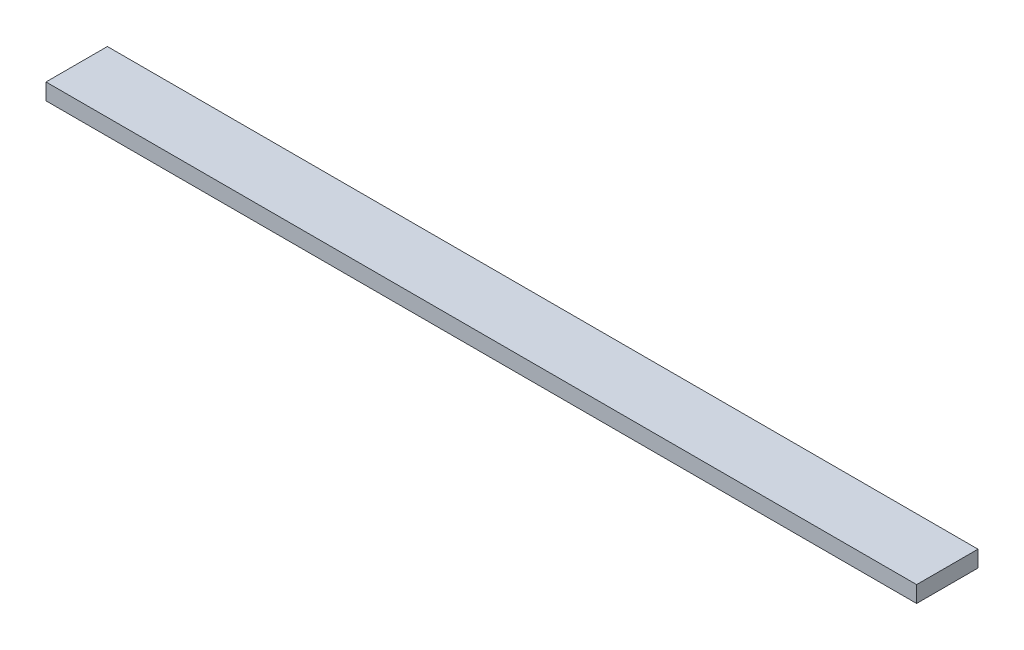
ISO-10303-21;
HEADER;
FILE_DESCRIPTION(('STEP AP214'),'2;1');
FILE_NAME('part.step','',(''),(''),'','','');
FILE_SCHEMA(('AUTOMOTIVE_DESIGN { 1 0 10303 214 1 1 1 1 }'));
ENDSEC;
DATA;
#1=APPLICATION_CONTEXT('core data for automotive mechanical design processes');
#2=APPLICATION_PROTOCOL_DEFINITION('international standard','automotive_design',2000,#1);
#3=PRODUCT_CONTEXT('',#1,'mechanical');
#4=PRODUCT('Part','Part','',(#3));
#5=PRODUCT_RELATED_PRODUCT_CATEGORY('part','',(#4));
#6=PRODUCT_DEFINITION_FORMATION('','',#4);
#7=PRODUCT_DEFINITION_CONTEXT('part definition',#1,'design');
#8=PRODUCT_DEFINITION('design','',#6,#7);
#9=PRODUCT_DEFINITION_SHAPE('','',#8);
#10=(LENGTH_UNIT() NAMED_UNIT(*) SI_UNIT(.MILLI.,.METRE.));
#11=(NAMED_UNIT(*) PLANE_ANGLE_UNIT() SI_UNIT($,.RADIAN.));
#12=(NAMED_UNIT(*) SI_UNIT($,.STERADIAN.) SOLID_ANGLE_UNIT());
#13=UNCERTAINTY_MEASURE_WITH_UNIT(LENGTH_MEASURE(1.E-05),#10,'distance_accuracy_value','');
#14=(GEOMETRIC_REPRESENTATION_CONTEXT(3) GLOBAL_UNCERTAINTY_ASSIGNED_CONTEXT((#13)) GLOBAL_UNIT_ASSIGNED_CONTEXT((#10,
#11,#12)) REPRESENTATION_CONTEXT('',''));
#15=CARTESIAN_POINT('',(0.,0.,0.));
#16=DIRECTION('',(0.,0.,1.));
#17=DIRECTION('',(1.,0.,0.));
#18=AXIS2_PLACEMENT_3D('',#15,#16,#17);
#19=CARTESIAN_POINT('',(106.37500000675,4.,7.5));
#20=DIRECTION('',(-1.,0.,0.));
#21=DIRECTION('',(0.,0.,1.));
#22=AXIS2_PLACEMENT_3D('',#19,#20,#21);
#23=PLANE('',#22);
#24=DIRECTION('',(0.,0.,-1.));
#25=VECTOR('',#24,1.);
#26=CARTESIAN_POINT('',(106.37500000675,0.,7.5));
#27=LINE('',#26,#25);
#28=CARTESIAN_POINT('',(106.37500000675,0.,7.5));
#29=VERTEX_POINT('',#28);
#30=CARTESIAN_POINT('',(106.37500000675,0.,-7.5));
#31=VERTEX_POINT('',#30);
#32=EDGE_CURVE('E110',#29,#31,#27,.T.);
#33=ORIENTED_EDGE('',*,*,#32,.T.);
#34=DIRECTION('',(0.,-1.,0.));
#35=VECTOR('',#34,1.);
#36=CARTESIAN_POINT('',(106.37500000675,4.,-7.5));
#37=LINE('',#36,#35);
#38=CARTESIAN_POINT('',(106.37500000675,4.,-7.5));
#39=VERTEX_POINT('',#38);
#40=EDGE_CURVE('E11',#39,#31,#37,.T.);
#41=ORIENTED_EDGE('',*,*,#40,.F.);
#42=DIRECTION('',(0.,0.,-1.));
#43=VECTOR('',#42,1.);
#44=CARTESIAN_POINT('',(106.37500000675,4.,7.5));
#45=LINE('',#44,#43);
#46=CARTESIAN_POINT('',(106.37500000675,4.,7.5));
#47=VERTEX_POINT('',#46);
#48=EDGE_CURVE('E93',#47,#39,#45,.T.);
#49=ORIENTED_EDGE('',*,*,#48,.F.);
#50=DIRECTION('',(0.,-1.,0.));
#51=VECTOR('',#50,1.);
#52=CARTESIAN_POINT('',(106.37500000675,4.,7.5));
#53=LINE('',#52,#51);
#54=EDGE_CURVE('E106',#47,#29,#53,.T.);
#55=ORIENTED_EDGE('',*,*,#54,.T.);
#56=EDGE_LOOP('',(#33,#41,#49,#55));
#57=FACE_BOUND('',#56,.T.);
#58=ADVANCED_FACE('F41',(#57),#23,.F.);
#59=CARTESIAN_POINT('',(-106.37500000675,4.,-7.5));
#60=DIRECTION('',(0.,0.,1.));
#61=DIRECTION('',(1.,0.,0.));
#62=AXIS2_PLACEMENT_3D('',#59,#60,#61);
#63=PLANE('',#62);
#64=DIRECTION('',(-1.,0.,0.));
#65=VECTOR('',#64,1.);
#66=CARTESIAN_POINT('',(-106.37500000675,0.,-7.5));
#67=LINE('',#66,#65);
#68=CARTESIAN_POINT('',(-106.37500000675,0.,-7.5));
#69=VERTEX_POINT('',#68);
#70=EDGE_CURVE('E98',#31,#69,#67,.T.);
#71=ORIENTED_EDGE('',*,*,#70,.T.);
#72=DIRECTION('',(0.,-1.,0.));
#73=VECTOR('',#72,1.);
#74=CARTESIAN_POINT('',(-106.37500000675,4.,-7.5));
#75=LINE('',#74,#73);
#76=CARTESIAN_POINT('',(-106.37500000675,4.,-7.5));
#77=VERTEX_POINT('',#76);
#78=EDGE_CURVE('E50',#77,#69,#75,.T.);
#79=ORIENTED_EDGE('',*,*,#78,.F.);
#80=DIRECTION('',(-1.,0.,0.));
#81=VECTOR('',#80,1.);
#82=CARTESIAN_POINT('',(-106.37500000675,4.,-7.5));
#83=LINE('',#82,#81);
#84=EDGE_CURVE('E88',#39,#77,#83,.T.);
#85=ORIENTED_EDGE('',*,*,#84,.F.);
#86=ORIENTED_EDGE('',*,*,#40,.T.);
#87=EDGE_LOOP('',(#71,#79,#85,#86));
#88=FACE_BOUND('',#87,.T.);
#89=ADVANCED_FACE('F97',(#88),#63,.F.);
#90=CARTESIAN_POINT('',(-106.37500000675,4.,7.5));
#91=DIRECTION('',(1.,0.,0.));
#92=DIRECTION('',(0.,0.,-1.));
#93=AXIS2_PLACEMENT_3D('',#90,#91,#92);
#94=PLANE('',#93);
#95=DIRECTION('',(0.,0.,1.));
#96=VECTOR('',#95,1.);
#97=CARTESIAN_POINT('',(-106.37500000675,0.,7.5));
#98=LINE('',#97,#96);
#99=CARTESIAN_POINT('',(-106.37500000675,0.,7.5));
#100=VERTEX_POINT('',#99);
#101=EDGE_CURVE('E75',#69,#100,#98,.T.);
#102=ORIENTED_EDGE('',*,*,#101,.T.);
#103=DIRECTION('',(0.,-1.,0.));
#104=VECTOR('',#103,1.);
#105=CARTESIAN_POINT('',(-106.37500000675,4.,7.5));
#106=LINE('',#105,#104);
#107=CARTESIAN_POINT('',(-106.37500000675,4.,7.5));
#108=VERTEX_POINT('',#107);
#109=EDGE_CURVE('E100',#108,#100,#106,.T.);
#110=ORIENTED_EDGE('',*,*,#109,.F.);
#111=DIRECTION('',(0.,0.,1.));
#112=VECTOR('',#111,1.);
#113=CARTESIAN_POINT('',(-106.37500000675,4.,7.5));
#114=LINE('',#113,#112);
#115=EDGE_CURVE('E91',#77,#108,#114,.T.);
#116=ORIENTED_EDGE('',*,*,#115,.F.);
#117=ORIENTED_EDGE('',*,*,#78,.T.);
#118=EDGE_LOOP('',(#102,#110,#116,#117));
#119=FACE_BOUND('',#118,.T.);
#120=ADVANCED_FACE('F101',(#119),#94,.F.);
#121=CARTESIAN_POINT('',(-106.37500000675,4.,7.5));
#122=DIRECTION('',(0.,0.,-1.));
#123=DIRECTION('',(-1.,0.,0.));
#124=AXIS2_PLACEMENT_3D('',#121,#122,#123);
#125=PLANE('',#124);
#126=DIRECTION('',(1.,0.,0.));
#127=VECTOR('',#126,1.);
#128=CARTESIAN_POINT('',(-106.37500000675,0.,7.5));
#129=LINE('',#128,#127);
#130=EDGE_CURVE('E81',#100,#29,#129,.T.);
#131=ORIENTED_EDGE('',*,*,#130,.T.);
#132=ORIENTED_EDGE('',*,*,#54,.F.);
#133=DIRECTION('',(1.,0.,0.));
#134=VECTOR('',#133,1.);
#135=CARTESIAN_POINT('',(-106.37500000675,4.,7.5));
#136=LINE('',#135,#134);
#137=EDGE_CURVE('E58',#108,#47,#136,.T.);
#138=ORIENTED_EDGE('',*,*,#137,.F.);
#139=ORIENTED_EDGE('',*,*,#109,.T.);
#140=EDGE_LOOP('',(#131,#132,#138,#139));
#141=FACE_BOUND('',#140,.T.);
#142=ADVANCED_FACE('F124',(#141),#125,.F.);
#143=CARTESIAN_POINT('',(0.,4.,0.));
#144=DIRECTION('',(0.,-1.,0.));
#145=DIRECTION('',(0.,0.,-1.));
#146=AXIS2_PLACEMENT_3D('',#143,#144,#145);
#147=PLANE('',#146);
#148=ORIENTED_EDGE('',*,*,#48,.T.);
#149=ORIENTED_EDGE('',*,*,#84,.T.);
#150=ORIENTED_EDGE('',*,*,#115,.T.);
#151=ORIENTED_EDGE('',*,*,#137,.T.);
#152=EDGE_LOOP('',(#148,#149,#150,#151));
#153=FACE_BOUND('',#152,.T.);
#154=ADVANCED_FACE('F89',(#153),#147,.F.);
#155=CARTESIAN_POINT('',(0.,0.,0.));
#156=DIRECTION('',(0.,-1.,0.));
#157=DIRECTION('',(0.,0.,-1.));
#158=AXIS2_PLACEMENT_3D('',#155,#156,#157);
#159=PLANE('',#158);
#160=ORIENTED_EDGE('',*,*,#32,.F.);
#161=ORIENTED_EDGE('',*,*,#130,.F.);
#162=ORIENTED_EDGE('',*,*,#101,.F.);
#163=ORIENTED_EDGE('',*,*,#70,.F.);
#164=EDGE_LOOP('',(#160,#161,#162,#163));
#165=FACE_BOUND('',#164,.T.);
#166=ADVANCED_FACE('F127',(#165),#159,.T.);
#167=CLOSED_SHELL('',(#58,#89,#120,#142,#154,#166));
#168=MANIFOLD_SOLID_BREP('B2',#167);
#169=ADVANCED_BREP_SHAPE_REPRESENTATION('',(#18,#168),#14);
#170=SHAPE_DEFINITION_REPRESENTATION(#9,#169);
ENDSEC;
END-ISO-10303-21;
